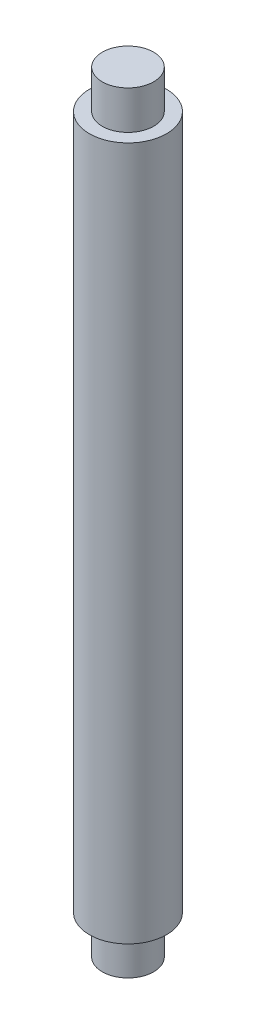
ISO-10303-21;
HEADER;
FILE_DESCRIPTION(('STEP AP214'),'2;1');
FILE_NAME('part.step','',(''),(''),'','','');
FILE_SCHEMA(('AUTOMOTIVE_DESIGN { 1 0 10303 214 1 1 1 1 }'));
ENDSEC;
DATA;
#1=APPLICATION_CONTEXT('core data for automotive mechanical design processes');
#2=APPLICATION_PROTOCOL_DEFINITION('international standard','automotive_design',2000,#1);
#3=PRODUCT_CONTEXT('',#1,'mechanical');
#4=PRODUCT('Part','Part','',(#3));
#5=PRODUCT_RELATED_PRODUCT_CATEGORY('part','',(#4));
#6=PRODUCT_DEFINITION_FORMATION('','',#4);
#7=PRODUCT_DEFINITION_CONTEXT('part definition',#1,'design');
#8=PRODUCT_DEFINITION('design','',#6,#7);
#9=PRODUCT_DEFINITION_SHAPE('','',#8);
#10=(LENGTH_UNIT() NAMED_UNIT(*) SI_UNIT(.MILLI.,.METRE.));
#11=(NAMED_UNIT(*) PLANE_ANGLE_UNIT() SI_UNIT($,.RADIAN.));
#12=(NAMED_UNIT(*) SI_UNIT($,.STERADIAN.) SOLID_ANGLE_UNIT());
#13=UNCERTAINTY_MEASURE_WITH_UNIT(LENGTH_MEASURE(1.E-05),#10,'distance_accuracy_value','');
#14=(GEOMETRIC_REPRESENTATION_CONTEXT(3) GLOBAL_UNCERTAINTY_ASSIGNED_CONTEXT((#13)) GLOBAL_UNIT_ASSIGNED_CONTEXT((#10,
#11,#12)) REPRESENTATION_CONTEXT('',''));
#15=CARTESIAN_POINT('',(0.,0.,0.));
#16=DIRECTION('',(0.,0.,1.));
#17=DIRECTION('',(1.,0.,0.));
#18=AXIS2_PLACEMENT_3D('',#15,#16,#17);
#19=CARTESIAN_POINT('',(0.,37.8061787940949,-16.6289987796458));
#20=DIRECTION('',(0.,-1.,0.));
#21=DIRECTION('',(0.,0.,-1.));
#22=AXIS2_PLACEMENT_3D('',#19,#20,#21);
#23=PLANE('',#22);
#24=CARTESIAN_POINT('',(0.,37.8061787940949,-16.6289987796458));
#25=DIRECTION('',(0.,1.,0.));
#26=DIRECTION('',(0.,0.,1.));
#27=AXIS2_PLACEMENT_3D('',#24,#25,#26);
#28=CIRCLE('',#27,2.);
#29=CARTESIAN_POINT('',(0.,37.8061787940949,-14.6289987796458));
#30=VERTEX_POINT('',#29);
#31=EDGE_CURVE('E10',#30,#30,#28,.T.);
#32=ORIENTED_EDGE('',*,*,#31,.T.);
#33=EDGE_LOOP('',(#32));
#34=FACE_BOUND('',#33,.T.);
#35=ADVANCED_FACE('F31',(#34),#23,.F.);
#36=CARTESIAN_POINT('',(0.,37.8061787940949,-16.6289987796458));
#37=DIRECTION('',(0.,1.,0.));
#38=DIRECTION('',(0.,0.,1.));
#39=AXIS2_PLACEMENT_3D('',#36,#37,#38);
#40=CYLINDRICAL_SURFACE('',#39,2.);
#41=ORIENTED_EDGE('',*,*,#31,.F.);
#42=EDGE_LOOP('',(#41));
#43=FACE_BOUND('',#42,.T.);
#44=CARTESIAN_POINT('',(0.,34.8061787940949,-16.6289987796458));
#45=DIRECTION('',(0.,1.,0.));
#46=DIRECTION('',(0.,0.,1.));
#47=AXIS2_PLACEMENT_3D('',#44,#45,#46);
#48=CIRCLE('',#47,2.);
#49=CARTESIAN_POINT('',(0.,34.8061787940949,-14.6289987796458));
#50=VERTEX_POINT('',#49);
#51=EDGE_CURVE('E37',#50,#50,#48,.T.);
#52=ORIENTED_EDGE('',*,*,#51,.T.);
#53=EDGE_LOOP('',(#52));
#54=FACE_BOUND('',#53,.T.);
#55=ADVANCED_FACE('F69',(#43,#54),#40,.T.);
#56=CARTESIAN_POINT('',(0.,34.8061787940949,-18.6289987796458));
#57=DIRECTION('',(0.,-1.,0.));
#58=DIRECTION('',(0.,0.,-1.));
#59=AXIS2_PLACEMENT_3D('',#56,#57,#58);
#60=PLANE('',#59);
#61=ORIENTED_EDGE('',*,*,#51,.F.);
#62=EDGE_LOOP('',(#61));
#63=FACE_BOUND('',#62,.T.);
#64=CARTESIAN_POINT('',(0.,34.8061787940949,-16.6289987796458));
#65=DIRECTION('',(0.,1.,0.));
#66=DIRECTION('',(0.,0.,1.));
#67=AXIS2_PLACEMENT_3D('',#64,#65,#66);
#68=CIRCLE('',#67,3.);
#69=CARTESIAN_POINT('',(0.,34.8061787940949,-13.6289987796458));
#70=VERTEX_POINT('',#69);
#71=EDGE_CURVE('E41',#70,#70,#68,.T.);
#72=ORIENTED_EDGE('',*,*,#71,.T.);
#73=EDGE_LOOP('',(#72));
#74=FACE_BOUND('',#73,.T.);
#75=ADVANCED_FACE('F73',(#63,#74),#60,.F.);
#76=CARTESIAN_POINT('',(0.,37.8061787940949,-16.6289987796458));
#77=DIRECTION('',(0.,1.,0.));
#78=DIRECTION('',(0.,0.,1.));
#79=AXIS2_PLACEMENT_3D('',#76,#77,#78);
#80=CYLINDRICAL_SURFACE('',#79,3.);
#81=ORIENTED_EDGE('',*,*,#71,.F.);
#82=EDGE_LOOP('',(#81));
#83=FACE_BOUND('',#82,.T.);
#84=CARTESIAN_POINT('',(0.,-19.1938212059051,-16.6289987796458));
#85=DIRECTION('',(0.,1.,0.));
#86=DIRECTION('',(0.,0.,1.));
#87=AXIS2_PLACEMENT_3D('',#84,#85,#86);
#88=CIRCLE('',#87,3.);
#89=CARTESIAN_POINT('',(0.,-19.1938212059051,-13.6289987796458));
#90=VERTEX_POINT('',#89);
#91=EDGE_CURVE('E45',#90,#90,#88,.T.);
#92=ORIENTED_EDGE('',*,*,#91,.T.);
#93=EDGE_LOOP('',(#92));
#94=FACE_BOUND('',#93,.T.);
#95=ADVANCED_FACE('F78',(#83,#94),#80,.T.);
#96=CARTESIAN_POINT('',(0.,-19.1938212059051,-18.6289987796458));
#97=DIRECTION('',(0.,1.,0.));
#98=DIRECTION('',(0.,0.,1.));
#99=AXIS2_PLACEMENT_3D('',#96,#97,#98);
#100=PLANE('',#99);
#101=ORIENTED_EDGE('',*,*,#91,.F.);
#102=EDGE_LOOP('',(#101));
#103=FACE_BOUND('',#102,.T.);
#104=CARTESIAN_POINT('',(0.,-19.1938212059051,-16.6289987796458));
#105=DIRECTION('',(0.,1.,0.));
#106=DIRECTION('',(0.,0.,1.));
#107=AXIS2_PLACEMENT_3D('',#104,#105,#106);
#108=CIRCLE('',#107,2.);
#109=CARTESIAN_POINT('',(0.,-19.1938212059051,-14.6289987796458));
#110=VERTEX_POINT('',#109);
#111=EDGE_CURVE('E50',#110,#110,#108,.T.);
#112=ORIENTED_EDGE('',*,*,#111,.T.);
#113=EDGE_LOOP('',(#112));
#114=FACE_BOUND('',#113,.T.);
#115=ADVANCED_FACE('F65',(#103,#114),#100,.F.);
#116=CARTESIAN_POINT('',(0.,37.8061787940949,-16.6289987796458));
#117=DIRECTION('',(0.,1.,0.));
#118=DIRECTION('',(0.,0.,1.));
#119=AXIS2_PLACEMENT_3D('',#116,#117,#118);
#120=CYLINDRICAL_SURFACE('',#119,2.);
#121=ORIENTED_EDGE('',*,*,#111,.F.);
#122=EDGE_LOOP('',(#121));
#123=FACE_BOUND('',#122,.T.);
#124=CARTESIAN_POINT('',(0.,-22.1938212059051,-16.6289987796458));
#125=DIRECTION('',(0.,1.,0.));
#126=DIRECTION('',(0.,0.,1.));
#127=AXIS2_PLACEMENT_3D('',#124,#125,#126);
#128=CIRCLE('',#127,2.);
#129=CARTESIAN_POINT('',(0.,-22.1938212059051,-14.6289987796458));
#130=VERTEX_POINT('',#129);
#131=EDGE_CURVE('E53',#130,#130,#128,.T.);
#132=ORIENTED_EDGE('',*,*,#131,.T.);
#133=EDGE_LOOP('',(#132));
#134=FACE_BOUND('',#133,.T.);
#135=ADVANCED_FACE('F57',(#123,#134),#120,.T.);
#136=CARTESIAN_POINT('',(0.,-22.1938212059051,-16.6289987796458));
#137=DIRECTION('',(0.,1.,0.));
#138=DIRECTION('',(0.,0.,1.));
#139=AXIS2_PLACEMENT_3D('',#136,#137,#138);
#140=PLANE('',#139);
#141=ORIENTED_EDGE('',*,*,#131,.F.);
#142=EDGE_LOOP('',(#141));
#143=FACE_BOUND('',#142,.T.);
#144=ADVANCED_FACE('F59',(#143),#140,.F.);
#145=CLOSED_SHELL('',(#35,#55,#75,#95,#115,#135,#144));
#146=MANIFOLD_SOLID_BREP('B2',#145);
#147=ADVANCED_BREP_SHAPE_REPRESENTATION('',(#18,#146),#14);
#148=SHAPE_DEFINITION_REPRESENTATION(#9,#147);
ENDSEC;
END-ISO-10303-21;
